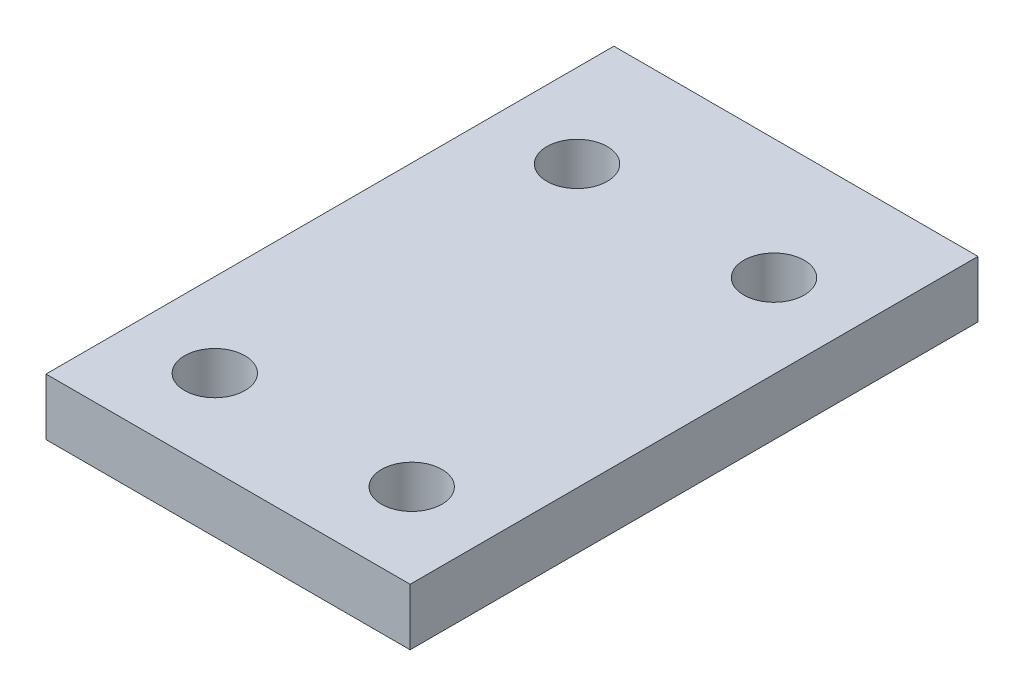
ISO-10303-21;
HEADER;
FILE_DESCRIPTION(('STEP AP214'),'2;1');
FILE_NAME('part.step','',(''),(''),'','','');
FILE_SCHEMA(('AUTOMOTIVE_DESIGN { 1 0 10303 214 1 1 1 1 }'));
ENDSEC;
DATA;
#1=APPLICATION_CONTEXT('core data for automotive mechanical design processes');
#2=APPLICATION_PROTOCOL_DEFINITION('international standard','automotive_design',2000,#1);
#3=PRODUCT_CONTEXT('',#1,'mechanical');
#4=PRODUCT('Part','Part','',(#3));
#5=PRODUCT_RELATED_PRODUCT_CATEGORY('part','',(#4));
#6=PRODUCT_DEFINITION_FORMATION('','',#4);
#7=PRODUCT_DEFINITION_CONTEXT('part definition',#1,'design');
#8=PRODUCT_DEFINITION('design','',#6,#7);
#9=PRODUCT_DEFINITION_SHAPE('','',#8);
#10=(LENGTH_UNIT() NAMED_UNIT(*) SI_UNIT(.MILLI.,.METRE.));
#11=(NAMED_UNIT(*) PLANE_ANGLE_UNIT() SI_UNIT($,.RADIAN.));
#12=(NAMED_UNIT(*) SI_UNIT($,.STERADIAN.) SOLID_ANGLE_UNIT());
#13=UNCERTAINTY_MEASURE_WITH_UNIT(LENGTH_MEASURE(1.E-05),#10,'distance_accuracy_value','');
#14=(GEOMETRIC_REPRESENTATION_CONTEXT(3) GLOBAL_UNCERTAINTY_ASSIGNED_CONTEXT((#13)) GLOBAL_UNIT_ASSIGNED_CONTEXT((#10,
#11,#12)) REPRESENTATION_CONTEXT('',''));
#15=CARTESIAN_POINT('',(0.,0.,0.));
#16=DIRECTION('',(0.,0.,1.));
#17=DIRECTION('',(1.,0.,0.));
#18=AXIS2_PLACEMENT_3D('',#15,#16,#17);
#19=CARTESIAN_POINT('',(20.3581,6.35,-31.75));
#20=DIRECTION('',(0.,-1.,0.));
#21=DIRECTION('',(0.,0.,-1.));
#22=AXIS2_PLACEMENT_3D('',#19,#20,#21);
#23=PLANE('',#22);
#24=CARTESIAN_POINT('',(-11.0108999999999,6.35,22.225));
#25=DIRECTION('',(0.,1.,0.));
#26=DIRECTION('',(0.,0.,-1.));
#27=AXIS2_PLACEMENT_3D('',#24,#25,#26);
#28=CIRCLE('',#27,3.37820000000001);
#29=CARTESIAN_POINT('',(-11.0108999999999,6.35,18.8468));
#30=VERTEX_POINT('',#29);
#31=EDGE_CURVE('E120',#30,#30,#28,.T.);
#32=ORIENTED_EDGE('',*,*,#31,.F.);
#33=EDGE_LOOP('',(#32));
#34=FACE_BOUND('',#33,.T.);
#35=CARTESIAN_POINT('',(11.0109,6.35,-18.288));
#36=DIRECTION('',(0.,1.,0.));
#37=DIRECTION('',(0.,0.,1.));
#38=AXIS2_PLACEMENT_3D('',#35,#36,#37);
#39=CIRCLE('',#38,3.3782);
#40=CARTESIAN_POINT('',(11.0109,6.35,-14.9098));
#41=VERTEX_POINT('',#40);
#42=EDGE_CURVE('E99',#41,#41,#39,.T.);
#43=ORIENTED_EDGE('',*,*,#42,.F.);
#44=EDGE_LOOP('',(#43));
#45=FACE_BOUND('',#44,.T.);
#46=DIRECTION('',(0.,0.,-1.));
#47=VECTOR('',#46,1.);
#48=CARTESIAN_POINT('',(20.3581,6.35,31.75));
#49=LINE('',#48,#47);
#50=CARTESIAN_POINT('',(20.3581,6.35,31.75));
#51=VERTEX_POINT('',#50);
#52=CARTESIAN_POINT('',(20.3581,6.35,-31.75));
#53=VERTEX_POINT('',#52);
#54=EDGE_CURVE('E84',#51,#53,#49,.T.);
#55=ORIENTED_EDGE('',*,*,#54,.T.);
#56=DIRECTION('',(-1.,0.,0.));
#57=VECTOR('',#56,1.);
#58=CARTESIAN_POINT('',(-20.3581,6.35,-31.75));
#59=LINE('',#58,#57);
#60=CARTESIAN_POINT('',(-20.3581,6.35,-31.75));
#61=VERTEX_POINT('',#60);
#62=EDGE_CURVE('E79',#53,#61,#59,.T.);
#63=ORIENTED_EDGE('',*,*,#62,.T.);
#64=DIRECTION('',(0.,0.,1.));
#65=VECTOR('',#64,1.);
#66=CARTESIAN_POINT('',(-20.3581,6.35,31.75));
#67=LINE('',#66,#65);
#68=CARTESIAN_POINT('',(-20.3581,6.35,31.75));
#69=VERTEX_POINT('',#68);
#70=EDGE_CURVE('E82',#61,#69,#67,.T.);
#71=ORIENTED_EDGE('',*,*,#70,.T.);
#72=DIRECTION('',(1.,0.,0.));
#73=VECTOR('',#72,1.);
#74=CARTESIAN_POINT('',(-20.3581,6.35,31.75));
#75=LINE('',#74,#73);
#76=EDGE_CURVE('E49',#69,#51,#75,.T.);
#77=ORIENTED_EDGE('',*,*,#76,.T.);
#78=EDGE_LOOP('',(#55,#63,#71,#77));
#79=FACE_BOUND('',#78,.T.);
#80=CARTESIAN_POINT('',(11.0109,6.35,22.225));
#81=DIRECTION('',(0.,1.,0.));
#82=DIRECTION('',(0.,0.,1.));
#83=AXIS2_PLACEMENT_3D('',#80,#81,#82);
#84=CIRCLE('',#83,3.3782);
#85=CARTESIAN_POINT('',(11.0109,6.35,25.6032));
#86=VERTEX_POINT('',#85);
#87=EDGE_CURVE('E114',#86,#86,#84,.T.);
#88=ORIENTED_EDGE('',*,*,#87,.F.);
#89=EDGE_LOOP('',(#88));
#90=FACE_BOUND('',#89,.T.);
#91=CARTESIAN_POINT('',(-11.0109000000001,6.35,-18.288));
#92=DIRECTION('',(0.,1.,0.));
#93=DIRECTION('',(0.,0.,-1.));
#94=AXIS2_PLACEMENT_3D('',#91,#92,#93);
#95=CIRCLE('',#94,3.3782);
#96=CARTESIAN_POINT('',(-11.0109000000001,6.35,-21.6662));
#97=VERTEX_POINT('',#96);
#98=EDGE_CURVE('E126',#97,#97,#95,.T.);
#99=ORIENTED_EDGE('',*,*,#98,.F.);
#100=EDGE_LOOP('',(#99));
#101=FACE_BOUND('',#100,.T.);
#102=ADVANCED_FACE('F32',(#34,#45,#79,#90,#101),#23,.F.);
#103=CARTESIAN_POINT('',(20.3581,0.,-31.75));
#104=DIRECTION('',(0.,-1.,0.));
#105=DIRECTION('',(0.,0.,-1.));
#106=AXIS2_PLACEMENT_3D('',#103,#104,#105);
#107=PLANE('',#106);
#108=CARTESIAN_POINT('',(-11.0108999999999,0.,22.225));
#109=DIRECTION('',(0.,1.,0.));
#110=DIRECTION('',(0.,0.,-1.));
#111=AXIS2_PLACEMENT_3D('',#108,#109,#110);
#112=CIRCLE('',#111,3.37820000000001);
#113=CARTESIAN_POINT('',(-11.0108999999999,0.,18.8468));
#114=VERTEX_POINT('',#113);
#115=EDGE_CURVE('E123',#114,#114,#112,.T.);
#116=ORIENTED_EDGE('',*,*,#115,.T.);
#117=EDGE_LOOP('',(#116));
#118=FACE_BOUND('',#117,.T.);
#119=CARTESIAN_POINT('',(11.0109,0.,-18.288));
#120=DIRECTION('',(0.,1.,0.));
#121=DIRECTION('',(0.,0.,1.));
#122=AXIS2_PLACEMENT_3D('',#119,#120,#121);
#123=CIRCLE('',#122,3.3782);
#124=CARTESIAN_POINT('',(11.0109,0.,-14.9098));
#125=VERTEX_POINT('',#124);
#126=EDGE_CURVE('E111',#125,#125,#123,.T.);
#127=ORIENTED_EDGE('',*,*,#126,.T.);
#128=EDGE_LOOP('',(#127));
#129=FACE_BOUND('',#128,.T.);
#130=DIRECTION('',(0.,0.,-1.));
#131=VECTOR('',#130,1.);
#132=CARTESIAN_POINT('',(20.3581,0.,31.75));
#133=LINE('',#132,#131);
#134=CARTESIAN_POINT('',(20.3581,0.,31.75));
#135=VERTEX_POINT('',#134);
#136=CARTESIAN_POINT('',(20.3581,0.,-31.75));
#137=VERTEX_POINT('',#136);
#138=EDGE_CURVE('E96',#135,#137,#133,.T.);
#139=ORIENTED_EDGE('',*,*,#138,.F.);
#140=DIRECTION('',(1.,0.,0.));
#141=VECTOR('',#140,1.);
#142=CARTESIAN_POINT('',(-20.3581,0.,31.75));
#143=LINE('',#142,#141);
#144=CARTESIAN_POINT('',(-20.3581,0.,31.75));
#145=VERTEX_POINT('',#144);
#146=EDGE_CURVE('E72',#145,#135,#143,.T.);
#147=ORIENTED_EDGE('',*,*,#146,.F.);
#148=DIRECTION('',(0.,0.,1.));
#149=VECTOR('',#148,1.);
#150=CARTESIAN_POINT('',(-20.3581,0.,31.75));
#151=LINE('',#150,#149);
#152=CARTESIAN_POINT('',(-20.3581,0.,-31.75));
#153=VERTEX_POINT('',#152);
#154=EDGE_CURVE('E66',#153,#145,#151,.T.);
#155=ORIENTED_EDGE('',*,*,#154,.F.);
#156=DIRECTION('',(-1.,0.,0.));
#157=VECTOR('',#156,1.);
#158=CARTESIAN_POINT('',(-20.3581,0.,-31.75));
#159=LINE('',#158,#157);
#160=EDGE_CURVE('E88',#137,#153,#159,.T.);
#161=ORIENTED_EDGE('',*,*,#160,.F.);
#162=EDGE_LOOP('',(#139,#147,#155,#161));
#163=FACE_BOUND('',#162,.T.);
#164=CARTESIAN_POINT('',(11.0109,0.,22.225));
#165=DIRECTION('',(0.,1.,0.));
#166=DIRECTION('',(0.,0.,1.));
#167=AXIS2_PLACEMENT_3D('',#164,#165,#166);
#168=CIRCLE('',#167,3.3782);
#169=CARTESIAN_POINT('',(11.0109,0.,25.6032));
#170=VERTEX_POINT('',#169);
#171=EDGE_CURVE('E117',#170,#170,#168,.T.);
#172=ORIENTED_EDGE('',*,*,#171,.T.);
#173=EDGE_LOOP('',(#172));
#174=FACE_BOUND('',#173,.T.);
#175=CARTESIAN_POINT('',(-11.0109000000001,0.,-18.288));
#176=DIRECTION('',(0.,1.,0.));
#177=DIRECTION('',(0.,0.,-1.));
#178=AXIS2_PLACEMENT_3D('',#175,#176,#177);
#179=CIRCLE('',#178,3.3782);
#180=CARTESIAN_POINT('',(-11.0109000000001,0.,-21.6662));
#181=VERTEX_POINT('',#180);
#182=EDGE_CURVE('E129',#181,#181,#179,.T.);
#183=ORIENTED_EDGE('',*,*,#182,.T.);
#184=EDGE_LOOP('',(#183));
#185=FACE_BOUND('',#184,.T.);
#186=ADVANCED_FACE('F107',(#118,#129,#163,#174,#185),#107,.T.);
#187=CARTESIAN_POINT('',(20.3581,6.35,31.75));
#188=DIRECTION('',(-1.,0.,0.));
#189=DIRECTION('',(0.,0.,1.));
#190=AXIS2_PLACEMENT_3D('',#187,#188,#189);
#191=PLANE('',#190);
#192=ORIENTED_EDGE('',*,*,#138,.T.);
#193=DIRECTION('',(0.,-1.,0.));
#194=VECTOR('',#193,1.);
#195=CARTESIAN_POINT('',(20.3581,6.35,-31.75));
#196=LINE('',#195,#194);
#197=EDGE_CURVE('E11',#53,#137,#196,.T.);
#198=ORIENTED_EDGE('',*,*,#197,.F.);
#199=ORIENTED_EDGE('',*,*,#54,.F.);
#200=DIRECTION('',(0.,-1.,0.));
#201=VECTOR('',#200,1.);
#202=CARTESIAN_POINT('',(20.3581,6.35,31.75));
#203=LINE('',#202,#201);
#204=EDGE_CURVE('E92',#51,#135,#203,.T.);
#205=ORIENTED_EDGE('',*,*,#204,.T.);
#206=EDGE_LOOP('',(#192,#198,#199,#205));
#207=FACE_BOUND('',#206,.T.);
#208=ADVANCED_FACE('F34',(#207),#191,.F.);
#209=CARTESIAN_POINT('',(-20.3581,6.35,-31.75));
#210=DIRECTION('',(0.,0.,1.));
#211=DIRECTION('',(1.,0.,0.));
#212=AXIS2_PLACEMENT_3D('',#209,#210,#211);
#213=PLANE('',#212);
#214=ORIENTED_EDGE('',*,*,#160,.T.);
#215=DIRECTION('',(0.,-1.,0.));
#216=VECTOR('',#215,1.);
#217=CARTESIAN_POINT('',(-20.3581,6.35,-31.75));
#218=LINE('',#217,#216);
#219=EDGE_CURVE('E41',#61,#153,#218,.T.);
#220=ORIENTED_EDGE('',*,*,#219,.F.);
#221=ORIENTED_EDGE('',*,*,#62,.F.);
#222=ORIENTED_EDGE('',*,*,#197,.T.);
#223=EDGE_LOOP('',(#214,#220,#221,#222));
#224=FACE_BOUND('',#223,.T.);
#225=ADVANCED_FACE('F87',(#224),#213,.F.);
#226=CARTESIAN_POINT('',(-20.3581,6.35,31.75));
#227=DIRECTION('',(1.,0.,0.));
#228=DIRECTION('',(0.,0.,-1.));
#229=AXIS2_PLACEMENT_3D('',#226,#227,#228);
#230=PLANE('',#229);
#231=ORIENTED_EDGE('',*,*,#154,.T.);
#232=DIRECTION('',(0.,-1.,0.));
#233=VECTOR('',#232,1.);
#234=CARTESIAN_POINT('',(-20.3581,6.35,31.75));
#235=LINE('',#234,#233);
#236=EDGE_CURVE('E89',#69,#145,#235,.T.);
#237=ORIENTED_EDGE('',*,*,#236,.F.);
#238=ORIENTED_EDGE('',*,*,#70,.F.);
#239=ORIENTED_EDGE('',*,*,#219,.T.);
#240=EDGE_LOOP('',(#231,#237,#238,#239));
#241=FACE_BOUND('',#240,.T.);
#242=ADVANCED_FACE('F90',(#241),#230,.F.);
#243=CARTESIAN_POINT('',(-20.3581,6.35,31.75));
#244=DIRECTION('',(0.,0.,-1.));
#245=DIRECTION('',(-1.,0.,0.));
#246=AXIS2_PLACEMENT_3D('',#243,#244,#245);
#247=PLANE('',#246);
#248=ORIENTED_EDGE('',*,*,#146,.T.);
#249=ORIENTED_EDGE('',*,*,#204,.F.);
#250=ORIENTED_EDGE('',*,*,#76,.F.);
#251=ORIENTED_EDGE('',*,*,#236,.T.);
#252=EDGE_LOOP('',(#248,#249,#250,#251));
#253=FACE_BOUND('',#252,.T.);
#254=ADVANCED_FACE('F104',(#253),#247,.F.);
#255=CARTESIAN_POINT('',(11.0109,6.35,-18.288));
#256=DIRECTION('',(0.,-1.,0.));
#257=DIRECTION('',(0.,0.,-1.));
#258=AXIS2_PLACEMENT_3D('',#255,#256,#257);
#259=CYLINDRICAL_SURFACE('',#258,3.3782);
#260=ORIENTED_EDGE('',*,*,#42,.T.);
#261=EDGE_LOOP('',(#260));
#262=FACE_BOUND('',#261,.T.);
#263=ORIENTED_EDGE('',*,*,#126,.F.);
#264=EDGE_LOOP('',(#263));
#265=FACE_BOUND('',#264,.T.);
#266=ADVANCED_FACE('F149',(#262,#265),#259,.F.);
#267=CARTESIAN_POINT('',(11.0109,6.35,22.225));
#268=DIRECTION('',(0.,-1.,0.));
#269=DIRECTION('',(0.,0.,-1.));
#270=AXIS2_PLACEMENT_3D('',#267,#268,#269);
#271=CYLINDRICAL_SURFACE('',#270,3.3782);
#272=ORIENTED_EDGE('',*,*,#87,.T.);
#273=EDGE_LOOP('',(#272));
#274=FACE_BOUND('',#273,.T.);
#275=ORIENTED_EDGE('',*,*,#171,.F.);
#276=EDGE_LOOP('',(#275));
#277=FACE_BOUND('',#276,.T.);
#278=ADVANCED_FACE('F195',(#274,#277),#271,.F.);
#279=CARTESIAN_POINT('',(-11.0108999999999,6.35,22.225));
#280=DIRECTION('',(0.,-1.,0.));
#281=DIRECTION('',(0.,0.,-1.));
#282=AXIS2_PLACEMENT_3D('',#279,#280,#281);
#283=CYLINDRICAL_SURFACE('',#282,3.37820000000001);
#284=ORIENTED_EDGE('',*,*,#31,.T.);
#285=EDGE_LOOP('',(#284));
#286=FACE_BOUND('',#285,.T.);
#287=ORIENTED_EDGE('',*,*,#115,.F.);
#288=EDGE_LOOP('',(#287));
#289=FACE_BOUND('',#288,.T.);
#290=ADVANCED_FACE('F203',(#286,#289),#283,.F.);
#291=CARTESIAN_POINT('',(-11.0109000000001,6.35,-18.288));
#292=DIRECTION('',(0.,-1.,0.));
#293=DIRECTION('',(0.,0.,-1.));
#294=AXIS2_PLACEMENT_3D('',#291,#292,#293);
#295=CYLINDRICAL_SURFACE('',#294,3.3782);
#296=ORIENTED_EDGE('',*,*,#98,.T.);
#297=EDGE_LOOP('',(#296));
#298=FACE_BOUND('',#297,.T.);
#299=ORIENTED_EDGE('',*,*,#182,.F.);
#300=EDGE_LOOP('',(#299));
#301=FACE_BOUND('',#300,.T.);
#302=ADVANCED_FACE('F135',(#298,#301),#295,.F.);
#303=CLOSED_SHELL('',(#102,#186,#208,#225,#242,#254,#266,#278,#290,#302));
#304=MANIFOLD_SOLID_BREP('B2',#303);
#305=ADVANCED_BREP_SHAPE_REPRESENTATION('',(#18,#304),#14);
#306=SHAPE_DEFINITION_REPRESENTATION(#9,#305);
ENDSEC;
END-ISO-10303-21;
